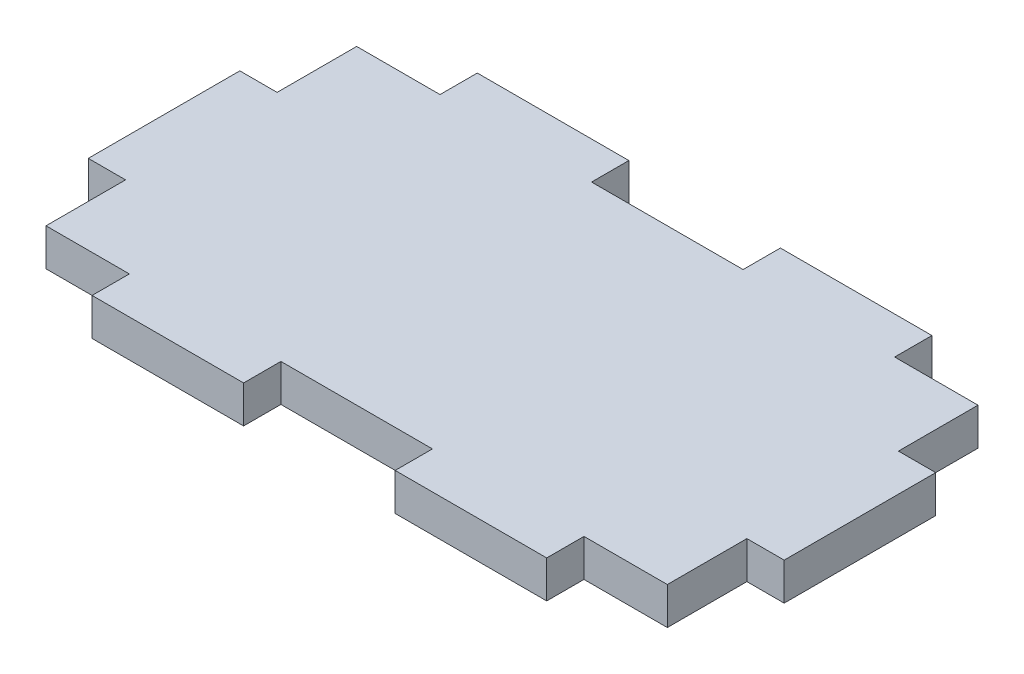
ISO-10303-21;
HEADER;
FILE_DESCRIPTION(('STEP AP214'),'2;1');
FILE_NAME('part.step','',(''),(''),'','','');
FILE_SCHEMA(('AUTOMOTIVE_DESIGN { 1 0 10303 214 1 1 1 1 }'));
ENDSEC;
DATA;
#1=APPLICATION_CONTEXT('core data for automotive mechanical design processes');
#2=APPLICATION_PROTOCOL_DEFINITION('international standard','automotive_design',2000,#1);
#3=PRODUCT_CONTEXT('',#1,'mechanical');
#4=PRODUCT('Part','Part','',(#3));
#5=PRODUCT_RELATED_PRODUCT_CATEGORY('part','',(#4));
#6=PRODUCT_DEFINITION_FORMATION('','',#4);
#7=PRODUCT_DEFINITION_CONTEXT('part definition',#1,'design');
#8=PRODUCT_DEFINITION('design','',#6,#7);
#9=PRODUCT_DEFINITION_SHAPE('','',#8);
#10=(LENGTH_UNIT() NAMED_UNIT(*) SI_UNIT(.MILLI.,.METRE.));
#11=(NAMED_UNIT(*) PLANE_ANGLE_UNIT() SI_UNIT($,.RADIAN.));
#12=(NAMED_UNIT(*) SI_UNIT($,.STERADIAN.) SOLID_ANGLE_UNIT());
#13=UNCERTAINTY_MEASURE_WITH_UNIT(LENGTH_MEASURE(1.E-05),#10,'distance_accuracy_value','');
#14=(GEOMETRIC_REPRESENTATION_CONTEXT(3) GLOBAL_UNCERTAINTY_ASSIGNED_CONTEXT((#13)) GLOBAL_UNIT_ASSIGNED_CONTEXT((#10,
#11,#12)) REPRESENTATION_CONTEXT('',''));
#15=CARTESIAN_POINT('',(0.,0.,0.));
#16=DIRECTION('',(0.,0.,1.));
#17=DIRECTION('',(1.,0.,0.));
#18=AXIS2_PLACEMENT_3D('',#15,#16,#17);
#19=CARTESIAN_POINT('',(199.415,6.,-59.));
#20=DIRECTION('',(0.,0.,1.));
#21=DIRECTION('',(1.,0.,0.));
#22=AXIS2_PLACEMENT_3D('',#19,#20,#21);
#23=PLANE('',#22);
#24=DIRECTION('',(-1.,0.,0.));
#25=VECTOR('',#24,1.);
#26=CARTESIAN_POINT('',(199.415,0.,-59.));
#27=LINE('',#26,#25);
#28=CARTESIAN_POINT('',(199.415,0.,-59.));
#29=VERTEX_POINT('',#28);
#30=CARTESIAN_POINT('',(186.,0.,-59.));
#31=VERTEX_POINT('',#30);
#32=EDGE_CURVE('E260',#29,#31,#27,.T.);
#33=ORIENTED_EDGE('',*,*,#32,.T.);
#34=DIRECTION('',(0.,-1.,0.));
#35=VECTOR('',#34,1.);
#36=CARTESIAN_POINT('',(186.,6.,-59.));
#37=LINE('',#36,#35);
#38=CARTESIAN_POINT('',(186.,6.,-59.));
#39=VERTEX_POINT('',#38);
#40=EDGE_CURVE('E11',#39,#31,#37,.T.);
#41=ORIENTED_EDGE('',*,*,#40,.F.);
#42=DIRECTION('',(-1.,0.,0.));
#43=VECTOR('',#42,1.);
#44=CARTESIAN_POINT('',(199.415,6.,-59.));
#45=LINE('',#44,#43);
#46=CARTESIAN_POINT('',(199.415,6.,-59.));
#47=VERTEX_POINT('',#46);
#48=EDGE_CURVE('E342',#47,#39,#45,.T.);
#49=ORIENTED_EDGE('',*,*,#48,.F.);
#50=DIRECTION('',(0.,-1.,0.));
#51=VECTOR('',#50,1.);
#52=CARTESIAN_POINT('',(199.415,6.,-59.));
#53=LINE('',#52,#51);
#54=EDGE_CURVE('E256',#47,#29,#53,.T.);
#55=ORIENTED_EDGE('',*,*,#54,.T.);
#56=EDGE_LOOP('',(#33,#41,#49,#55));
#57=FACE_BOUND('',#56,.T.);
#58=ADVANCED_FACE('F39',(#57),#23,.F.);
#59=CARTESIAN_POINT('',(186.,6.,-59.));
#60=DIRECTION('',(1.,0.,0.));
#61=DIRECTION('',(0.,0.,-1.));
#62=AXIS2_PLACEMENT_3D('',#59,#60,#61);
#63=PLANE('',#62);
#64=DIRECTION('',(0.,0.,1.));
#65=VECTOR('',#64,1.);
#66=CARTESIAN_POINT('',(186.,0.,-59.));
#67=LINE('',#66,#65);
#68=CARTESIAN_POINT('',(186.,0.,-46.195));
#69=VERTEX_POINT('',#68);
#70=EDGE_CURVE('E264',#31,#69,#67,.T.);
#71=ORIENTED_EDGE('',*,*,#70,.T.);
#72=DIRECTION('',(0.,-1.,0.));
#73=VECTOR('',#72,1.);
#74=CARTESIAN_POINT('',(186.,6.,-46.195));
#75=LINE('',#74,#73);
#76=CARTESIAN_POINT('',(186.,6.,-46.195));
#77=VERTEX_POINT('',#76);
#78=EDGE_CURVE('E48',#77,#69,#75,.T.);
#79=ORIENTED_EDGE('',*,*,#78,.F.);
#80=DIRECTION('',(0.,0.,1.));
#81=VECTOR('',#80,1.);
#82=CARTESIAN_POINT('',(186.,6.,-59.));
#83=LINE('',#82,#81);
#84=EDGE_CURVE('E159',#39,#77,#83,.T.);
#85=ORIENTED_EDGE('',*,*,#84,.F.);
#86=ORIENTED_EDGE('',*,*,#40,.T.);
#87=EDGE_LOOP('',(#71,#79,#85,#86));
#88=FACE_BOUND('',#87,.T.);
#89=ADVANCED_FACE('F548',(#88),#63,.F.);
#90=CARTESIAN_POINT('',(186.,6.,-46.195));
#91=DIRECTION('',(0.,0.,1.));
#92=DIRECTION('',(1.,0.,0.));
#93=AXIS2_PLACEMENT_3D('',#90,#91,#92);
#94=PLANE('',#93);
#95=DIRECTION('',(-1.,0.,0.));
#96=VECTOR('',#95,1.);
#97=CARTESIAN_POINT('',(186.,0.,-46.195));
#98=LINE('',#97,#96);
#99=CARTESIAN_POINT('',(180.,0.,-46.195));
#100=VERTEX_POINT('',#99);
#101=EDGE_CURVE('E267',#69,#100,#98,.T.);
#102=ORIENTED_EDGE('',*,*,#101,.T.);
#103=DIRECTION('',(0.,-1.,0.));
#104=VECTOR('',#103,1.);
#105=CARTESIAN_POINT('',(180.,6.,-46.195));
#106=LINE('',#105,#104);
#107=CARTESIAN_POINT('',(180.,6.,-46.195));
#108=VERTEX_POINT('',#107);
#109=EDGE_CURVE('E433',#108,#100,#106,.T.);
#110=ORIENTED_EDGE('',*,*,#109,.F.);
#111=DIRECTION('',(-1.,0.,0.));
#112=VECTOR('',#111,1.);
#113=CARTESIAN_POINT('',(186.,6.,-46.195));
#114=LINE('',#113,#112);
#115=EDGE_CURVE('E443',#77,#108,#114,.T.);
#116=ORIENTED_EDGE('',*,*,#115,.F.);
#117=ORIENTED_EDGE('',*,*,#78,.T.);
#118=EDGE_LOOP('',(#102,#110,#116,#117));
#119=FACE_BOUND('',#118,.T.);
#120=ADVANCED_FACE('F441',(#119),#94,.F.);
#121=CARTESIAN_POINT('',(180.,6.,-46.195));
#122=DIRECTION('',(1.,0.,0.));
#123=DIRECTION('',(0.,0.,-1.));
#124=AXIS2_PLACEMENT_3D('',#121,#122,#123);
#125=PLANE('',#124);
#126=DIRECTION('',(0.,0.,1.));
#127=VECTOR('',#126,1.);
#128=CARTESIAN_POINT('',(180.,0.,-46.195));
#129=LINE('',#128,#127);
#130=CARTESIAN_POINT('',(180.,0.,-21.805));
#131=VERTEX_POINT('',#130);
#132=EDGE_CURVE('E270',#100,#131,#129,.T.);
#133=ORIENTED_EDGE('',*,*,#132,.T.);
#134=DIRECTION('',(0.,-1.,0.));
#135=VECTOR('',#134,1.);
#136=CARTESIAN_POINT('',(180.,6.,-21.805));
#137=LINE('',#136,#135);
#138=CARTESIAN_POINT('',(180.,6.,-21.805));
#139=VERTEX_POINT('',#138);
#140=EDGE_CURVE('E429',#139,#131,#137,.T.);
#141=ORIENTED_EDGE('',*,*,#140,.F.);
#142=DIRECTION('',(0.,0.,1.));
#143=VECTOR('',#142,1.);
#144=CARTESIAN_POINT('',(180.,6.,-46.195));
#145=LINE('',#144,#143);
#146=EDGE_CURVE('E462',#108,#139,#145,.T.);
#147=ORIENTED_EDGE('',*,*,#146,.F.);
#148=ORIENTED_EDGE('',*,*,#109,.T.);
#149=EDGE_LOOP('',(#133,#141,#147,#148));
#150=FACE_BOUND('',#149,.T.);
#151=ADVANCED_FACE('F452',(#150),#125,.F.);
#152=CARTESIAN_POINT('',(180.,6.,-21.805));
#153=DIRECTION('',(0.,0.,-1.));
#154=DIRECTION('',(-1.,0.,0.));
#155=AXIS2_PLACEMENT_3D('',#152,#153,#154);
#156=PLANE('',#155);
#157=DIRECTION('',(1.,0.,0.));
#158=VECTOR('',#157,1.);
#159=CARTESIAN_POINT('',(180.,0.,-21.805));
#160=LINE('',#159,#158);
#161=CARTESIAN_POINT('',(186.,0.,-21.805));
#162=VERTEX_POINT('',#161);
#163=EDGE_CURVE('E273',#131,#162,#160,.T.);
#164=ORIENTED_EDGE('',*,*,#163,.T.);
#165=DIRECTION('',(0.,-1.,0.));
#166=VECTOR('',#165,1.);
#167=CARTESIAN_POINT('',(186.,6.,-21.805));
#168=LINE('',#167,#166);
#169=CARTESIAN_POINT('',(186.,6.,-21.805));
#170=VERTEX_POINT('',#169);
#171=EDGE_CURVE('E425',#170,#162,#168,.T.);
#172=ORIENTED_EDGE('',*,*,#171,.F.);
#173=DIRECTION('',(1.,0.,0.));
#174=VECTOR('',#173,1.);
#175=CARTESIAN_POINT('',(180.,6.,-21.805));
#176=LINE('',#175,#174);
#177=EDGE_CURVE('E458',#139,#170,#176,.T.);
#178=ORIENTED_EDGE('',*,*,#177,.F.);
#179=ORIENTED_EDGE('',*,*,#140,.T.);
#180=EDGE_LOOP('',(#164,#172,#178,#179));
#181=FACE_BOUND('',#180,.T.);
#182=ADVANCED_FACE('F456',(#181),#156,.F.);
#183=CARTESIAN_POINT('',(186.,6.,-21.805));
#184=DIRECTION('',(1.,0.,0.));
#185=DIRECTION('',(0.,0.,-1.));
#186=AXIS2_PLACEMENT_3D('',#183,#184,#185);
#187=PLANE('',#186);
#188=DIRECTION('',(0.,0.,1.));
#189=VECTOR('',#188,1.);
#190=CARTESIAN_POINT('',(186.,0.,-21.805));
#191=LINE('',#190,#189);
#192=CARTESIAN_POINT('',(186.,0.,-9.));
#193=VERTEX_POINT('',#192);
#194=EDGE_CURVE('E276',#162,#193,#191,.T.);
#195=ORIENTED_EDGE('',*,*,#194,.T.);
#196=DIRECTION('',(0.,-1.,0.));
#197=VECTOR('',#196,1.);
#198=CARTESIAN_POINT('',(186.,6.,-9.));
#199=LINE('',#198,#197);
#200=CARTESIAN_POINT('',(186.,6.,-9.));
#201=VERTEX_POINT('',#200);
#202=EDGE_CURVE('E421',#201,#193,#199,.T.);
#203=ORIENTED_EDGE('',*,*,#202,.F.);
#204=DIRECTION('',(0.,0.,1.));
#205=VECTOR('',#204,1.);
#206=CARTESIAN_POINT('',(186.,6.,-21.805));
#207=LINE('',#206,#205);
#208=EDGE_CURVE('E461',#170,#201,#207,.T.);
#209=ORIENTED_EDGE('',*,*,#208,.F.);
#210=ORIENTED_EDGE('',*,*,#171,.T.);
#211=EDGE_LOOP('',(#195,#203,#209,#210));
#212=FACE_BOUND('',#211,.T.);
#213=ADVANCED_FACE('F561',(#212),#187,.F.);
#214=CARTESIAN_POINT('',(186.,6.,-9.));
#215=DIRECTION('',(0.,0.,-1.));
#216=DIRECTION('',(-1.,0.,0.));
#217=AXIS2_PLACEMENT_3D('',#214,#215,#216);
#218=PLANE('',#217);
#219=DIRECTION('',(1.,0.,0.));
#220=VECTOR('',#219,1.);
#221=CARTESIAN_POINT('',(186.,0.,-9.));
#222=LINE('',#221,#220);
#223=CARTESIAN_POINT('',(199.415,0.,-9.));
#224=VERTEX_POINT('',#223);
#225=EDGE_CURVE('E279',#193,#224,#222,.T.);
#226=ORIENTED_EDGE('',*,*,#225,.T.);
#227=DIRECTION('',(0.,-1.,0.));
#228=VECTOR('',#227,1.);
#229=CARTESIAN_POINT('',(199.415,6.,-9.));
#230=LINE('',#229,#228);
#231=CARTESIAN_POINT('',(199.415,6.,-9.));
#232=VERTEX_POINT('',#231);
#233=EDGE_CURVE('E417',#232,#224,#230,.T.);
#234=ORIENTED_EDGE('',*,*,#233,.F.);
#235=DIRECTION('',(1.,0.,0.));
#236=VECTOR('',#235,1.);
#237=CARTESIAN_POINT('',(186.,6.,-9.));
#238=LINE('',#237,#236);
#239=EDGE_CURVE('E466',#201,#232,#238,.T.);
#240=ORIENTED_EDGE('',*,*,#239,.F.);
#241=ORIENTED_EDGE('',*,*,#202,.T.);
#242=EDGE_LOOP('',(#226,#234,#240,#241));
#243=FACE_BOUND('',#242,.T.);
#244=ADVANCED_FACE('F564',(#243),#218,.F.);
#245=CARTESIAN_POINT('',(199.415,6.,-9.));
#246=DIRECTION('',(1.,0.,0.));
#247=DIRECTION('',(0.,0.,-1.));
#248=AXIS2_PLACEMENT_3D('',#245,#246,#247);
#249=PLANE('',#248);
#250=DIRECTION('',(0.,0.,1.));
#251=VECTOR('',#250,1.);
#252=CARTESIAN_POINT('',(199.415,0.,-9.));
#253=LINE('',#252,#251);
#254=CARTESIAN_POINT('',(199.415,0.,-3.));
#255=VERTEX_POINT('',#254);
#256=EDGE_CURVE('E282',#224,#255,#253,.T.);
#257=ORIENTED_EDGE('',*,*,#256,.T.);
#258=DIRECTION('',(0.,-1.,0.));
#259=VECTOR('',#258,1.);
#260=CARTESIAN_POINT('',(199.415,6.,-3.));
#261=LINE('',#260,#259);
#262=CARTESIAN_POINT('',(199.415,6.,-3.));
#263=VERTEX_POINT('',#262);
#264=EDGE_CURVE('E413',#263,#255,#261,.T.);
#265=ORIENTED_EDGE('',*,*,#264,.F.);
#266=DIRECTION('',(0.,0.,1.));
#267=VECTOR('',#266,1.);
#268=CARTESIAN_POINT('',(199.415,6.,-9.));
#269=LINE('',#268,#267);
#270=EDGE_CURVE('E473',#232,#263,#269,.T.);
#271=ORIENTED_EDGE('',*,*,#270,.F.);
#272=ORIENTED_EDGE('',*,*,#233,.T.);
#273=EDGE_LOOP('',(#257,#265,#271,#272));
#274=FACE_BOUND('',#273,.T.);
#275=ADVANCED_FACE('F568',(#274),#249,.F.);
#276=CARTESIAN_POINT('',(199.415,6.,-3.));
#277=DIRECTION('',(0.,0.,-1.));
#278=DIRECTION('',(-1.,0.,0.));
#279=AXIS2_PLACEMENT_3D('',#276,#277,#278);
#280=PLANE('',#279);
#281=DIRECTION('',(1.,0.,0.));
#282=VECTOR('',#281,1.);
#283=CARTESIAN_POINT('',(199.415,0.,-3.));
#284=LINE('',#283,#282);
#285=CARTESIAN_POINT('',(223.805,0.,-3.));
#286=VERTEX_POINT('',#285);
#287=EDGE_CURVE('E285',#255,#286,#284,.T.);
#288=ORIENTED_EDGE('',*,*,#287,.T.);
#289=DIRECTION('',(0.,-1.,0.));
#290=VECTOR('',#289,1.);
#291=CARTESIAN_POINT('',(223.805,6.,-3.));
#292=LINE('',#291,#290);
#293=CARTESIAN_POINT('',(223.805,6.,-3.));
#294=VERTEX_POINT('',#293);
#295=EDGE_CURVE('E409',#294,#286,#292,.T.);
#296=ORIENTED_EDGE('',*,*,#295,.F.);
#297=DIRECTION('',(1.,0.,0.));
#298=VECTOR('',#297,1.);
#299=CARTESIAN_POINT('',(199.415,6.,-3.));
#300=LINE('',#299,#298);
#301=EDGE_CURVE('E476',#263,#294,#300,.T.);
#302=ORIENTED_EDGE('',*,*,#301,.F.);
#303=ORIENTED_EDGE('',*,*,#264,.T.);
#304=EDGE_LOOP('',(#288,#296,#302,#303));
#305=FACE_BOUND('',#304,.T.);
#306=ADVANCED_FACE('F572',(#305),#280,.F.);
#307=CARTESIAN_POINT('',(223.805,6.,-3.));
#308=DIRECTION('',(-1.,0.,0.));
#309=DIRECTION('',(0.,0.,1.));
#310=AXIS2_PLACEMENT_3D('',#307,#308,#309);
#311=PLANE('',#310);
#312=DIRECTION('',(0.,0.,-1.));
#313=VECTOR('',#312,1.);
#314=CARTESIAN_POINT('',(223.805,0.,-3.));
#315=LINE('',#314,#313);
#316=CARTESIAN_POINT('',(223.805,0.,-9.));
#317=VERTEX_POINT('',#316);
#318=EDGE_CURVE('E288',#286,#317,#315,.T.);
#319=ORIENTED_EDGE('',*,*,#318,.T.);
#320=DIRECTION('',(0.,-1.,0.));
#321=VECTOR('',#320,1.);
#322=CARTESIAN_POINT('',(223.805,6.,-9.));
#323=LINE('',#322,#321);
#324=CARTESIAN_POINT('',(223.805,6.,-9.));
#325=VERTEX_POINT('',#324);
#326=EDGE_CURVE('E405',#325,#317,#323,.T.);
#327=ORIENTED_EDGE('',*,*,#326,.F.);
#328=DIRECTION('',(0.,0.,-1.));
#329=VECTOR('',#328,1.);
#330=CARTESIAN_POINT('',(223.805,6.,-3.));
#331=LINE('',#330,#329);
#332=EDGE_CURVE('E479',#294,#325,#331,.T.);
#333=ORIENTED_EDGE('',*,*,#332,.F.);
#334=ORIENTED_EDGE('',*,*,#295,.T.);
#335=EDGE_LOOP('',(#319,#327,#333,#334));
#336=FACE_BOUND('',#335,.T.);
#337=ADVANCED_FACE('F576',(#336),#311,.F.);
#338=CARTESIAN_POINT('',(223.805,6.,-9.));
#339=DIRECTION('',(0.,0.,-1.));
#340=DIRECTION('',(-1.,0.,0.));
#341=AXIS2_PLACEMENT_3D('',#338,#339,#340);
#342=PLANE('',#341);
#343=DIRECTION('',(1.,0.,0.));
#344=VECTOR('',#343,1.);
#345=CARTESIAN_POINT('',(223.805,0.,-9.));
#346=LINE('',#345,#344);
#347=CARTESIAN_POINT('',(248.195,0.,-9.));
#348=VERTEX_POINT('',#347);
#349=EDGE_CURVE('E291',#317,#348,#346,.T.);
#350=ORIENTED_EDGE('',*,*,#349,.T.);
#351=DIRECTION('',(0.,-1.,0.));
#352=VECTOR('',#351,1.);
#353=CARTESIAN_POINT('',(248.195,6.,-9.));
#354=LINE('',#353,#352);
#355=CARTESIAN_POINT('',(248.195,6.,-9.));
#356=VERTEX_POINT('',#355);
#357=EDGE_CURVE('E401',#356,#348,#354,.T.);
#358=ORIENTED_EDGE('',*,*,#357,.F.);
#359=DIRECTION('',(1.,0.,0.));
#360=VECTOR('',#359,1.);
#361=CARTESIAN_POINT('',(223.805,6.,-9.));
#362=LINE('',#361,#360);
#363=EDGE_CURVE('E482',#325,#356,#362,.T.);
#364=ORIENTED_EDGE('',*,*,#363,.F.);
#365=ORIENTED_EDGE('',*,*,#326,.T.);
#366=EDGE_LOOP('',(#350,#358,#364,#365));
#367=FACE_BOUND('',#366,.T.);
#368=ADVANCED_FACE('F580',(#367),#342,.F.);
#369=CARTESIAN_POINT('',(248.195,6.,-9.));
#370=DIRECTION('',(1.,0.,0.));
#371=DIRECTION('',(0.,0.,-1.));
#372=AXIS2_PLACEMENT_3D('',#369,#370,#371);
#373=PLANE('',#372);
#374=DIRECTION('',(0.,0.,1.));
#375=VECTOR('',#374,1.);
#376=CARTESIAN_POINT('',(248.195,0.,-9.));
#377=LINE('',#376,#375);
#378=CARTESIAN_POINT('',(248.195,0.,-3.));
#379=VERTEX_POINT('',#378);
#380=EDGE_CURVE('E294',#348,#379,#377,.T.);
#381=ORIENTED_EDGE('',*,*,#380,.T.);
#382=DIRECTION('',(0.,-1.,0.));
#383=VECTOR('',#382,1.);
#384=CARTESIAN_POINT('',(248.195,6.,-3.));
#385=LINE('',#384,#383);
#386=CARTESIAN_POINT('',(248.195,6.,-3.));
#387=VERTEX_POINT('',#386);
#388=EDGE_CURVE('E397',#387,#379,#385,.T.);
#389=ORIENTED_EDGE('',*,*,#388,.F.);
#390=DIRECTION('',(0.,0.,1.));
#391=VECTOR('',#390,1.);
#392=CARTESIAN_POINT('',(248.195,6.,-9.));
#393=LINE('',#392,#391);
#394=EDGE_CURVE('E485',#356,#387,#393,.T.);
#395=ORIENTED_EDGE('',*,*,#394,.F.);
#396=ORIENTED_EDGE('',*,*,#357,.T.);
#397=EDGE_LOOP('',(#381,#389,#395,#396));
#398=FACE_BOUND('',#397,.T.);
#399=ADVANCED_FACE('F584',(#398),#373,.F.);
#400=CARTESIAN_POINT('',(248.195,6.,-3.));
#401=DIRECTION('',(0.,0.,-1.));
#402=DIRECTION('',(-1.,0.,0.));
#403=AXIS2_PLACEMENT_3D('',#400,#401,#402);
#404=PLANE('',#403);
#405=DIRECTION('',(1.,0.,0.));
#406=VECTOR('',#405,1.);
#407=CARTESIAN_POINT('',(248.195,0.,-3.));
#408=LINE('',#407,#406);
#409=CARTESIAN_POINT('',(272.585,0.,-3.));
#410=VERTEX_POINT('',#409);
#411=EDGE_CURVE('E297',#379,#410,#408,.T.);
#412=ORIENTED_EDGE('',*,*,#411,.T.);
#413=DIRECTION('',(0.,-1.,0.));
#414=VECTOR('',#413,1.);
#415=CARTESIAN_POINT('',(272.585,6.,-3.));
#416=LINE('',#415,#414);
#417=CARTESIAN_POINT('',(272.585,6.,-3.));
#418=VERTEX_POINT('',#417);
#419=EDGE_CURVE('E393',#418,#410,#416,.T.);
#420=ORIENTED_EDGE('',*,*,#419,.F.);
#421=DIRECTION('',(1.,0.,0.));
#422=VECTOR('',#421,1.);
#423=CARTESIAN_POINT('',(248.195,6.,-3.));
#424=LINE('',#423,#422);
#425=EDGE_CURVE('E488',#387,#418,#424,.T.);
#426=ORIENTED_EDGE('',*,*,#425,.F.);
#427=ORIENTED_EDGE('',*,*,#388,.T.);
#428=EDGE_LOOP('',(#412,#420,#426,#427));
#429=FACE_BOUND('',#428,.T.);
#430=ADVANCED_FACE('F588',(#429),#404,.F.);
#431=CARTESIAN_POINT('',(272.585,6.,-3.));
#432=DIRECTION('',(-1.,0.,0.));
#433=DIRECTION('',(0.,0.,1.));
#434=AXIS2_PLACEMENT_3D('',#431,#432,#433);
#435=PLANE('',#434);
#436=DIRECTION('',(0.,0.,-1.));
#437=VECTOR('',#436,1.);
#438=CARTESIAN_POINT('',(272.585,0.,-3.));
#439=LINE('',#438,#437);
#440=CARTESIAN_POINT('',(272.585,0.,-9.));
#441=VERTEX_POINT('',#440);
#442=EDGE_CURVE('E300',#410,#441,#439,.T.);
#443=ORIENTED_EDGE('',*,*,#442,.T.);
#444=DIRECTION('',(0.,-1.,0.));
#445=VECTOR('',#444,1.);
#446=CARTESIAN_POINT('',(272.585,6.,-9.));
#447=LINE('',#446,#445);
#448=CARTESIAN_POINT('',(272.585,6.,-9.));
#449=VERTEX_POINT('',#448);
#450=EDGE_CURVE('E389',#449,#441,#447,.T.);
#451=ORIENTED_EDGE('',*,*,#450,.F.);
#452=DIRECTION('',(0.,0.,-1.));
#453=VECTOR('',#452,1.);
#454=CARTESIAN_POINT('',(272.585,6.,-3.));
#455=LINE('',#454,#453);
#456=EDGE_CURVE('E491',#418,#449,#455,.T.);
#457=ORIENTED_EDGE('',*,*,#456,.F.);
#458=ORIENTED_EDGE('',*,*,#419,.T.);
#459=EDGE_LOOP('',(#443,#451,#457,#458));
#460=FACE_BOUND('',#459,.T.);
#461=ADVANCED_FACE('F592',(#460),#435,.F.);
#462=CARTESIAN_POINT('',(272.585,6.,-9.));
#463=DIRECTION('',(0.,0.,-1.));
#464=DIRECTION('',(-1.,0.,0.));
#465=AXIS2_PLACEMENT_3D('',#462,#463,#464);
#466=PLANE('',#465);
#467=DIRECTION('',(1.,0.,0.));
#468=VECTOR('',#467,1.);
#469=CARTESIAN_POINT('',(272.585,0.,-9.));
#470=LINE('',#469,#468);
#471=CARTESIAN_POINT('',(286.,0.,-9.));
#472=VERTEX_POINT('',#471);
#473=EDGE_CURVE('E303',#441,#472,#470,.T.);
#474=ORIENTED_EDGE('',*,*,#473,.T.);
#475=DIRECTION('',(0.,-1.,0.));
#476=VECTOR('',#475,1.);
#477=CARTESIAN_POINT('',(286.,6.,-9.));
#478=LINE('',#477,#476);
#479=CARTESIAN_POINT('',(286.,6.,-9.));
#480=VERTEX_POINT('',#479);
#481=EDGE_CURVE('E385',#480,#472,#478,.T.);
#482=ORIENTED_EDGE('',*,*,#481,.F.);
#483=DIRECTION('',(1.,0.,0.));
#484=VECTOR('',#483,1.);
#485=CARTESIAN_POINT('',(272.585,6.,-9.));
#486=LINE('',#485,#484);
#487=EDGE_CURVE('E494',#449,#480,#486,.T.);
#488=ORIENTED_EDGE('',*,*,#487,.F.);
#489=ORIENTED_EDGE('',*,*,#450,.T.);
#490=EDGE_LOOP('',(#474,#482,#488,#489));
#491=FACE_BOUND('',#490,.T.);
#492=ADVANCED_FACE('F596',(#491),#466,.F.);
#493=CARTESIAN_POINT('',(286.,6.,-9.));
#494=DIRECTION('',(-1.,0.,0.));
#495=DIRECTION('',(0.,0.,1.));
#496=AXIS2_PLACEMENT_3D('',#493,#494,#495);
#497=PLANE('',#496);
#498=DIRECTION('',(0.,0.,-1.));
#499=VECTOR('',#498,1.);
#500=CARTESIAN_POINT('',(286.,0.,-9.));
#501=LINE('',#500,#499);
#502=CARTESIAN_POINT('',(286.,0.,-21.805));
#503=VERTEX_POINT('',#502);
#504=EDGE_CURVE('E306',#472,#503,#501,.T.);
#505=ORIENTED_EDGE('',*,*,#504,.T.);
#506=DIRECTION('',(0.,-1.,0.));
#507=VECTOR('',#506,1.);
#508=CARTESIAN_POINT('',(286.,6.,-21.805));
#509=LINE('',#508,#507);
#510=CARTESIAN_POINT('',(286.,6.,-21.805));
#511=VERTEX_POINT('',#510);
#512=EDGE_CURVE('E381',#511,#503,#509,.T.);
#513=ORIENTED_EDGE('',*,*,#512,.F.);
#514=DIRECTION('',(0.,0.,-1.));
#515=VECTOR('',#514,1.);
#516=CARTESIAN_POINT('',(286.,6.,-9.));
#517=LINE('',#516,#515);
#518=EDGE_CURVE('E497',#480,#511,#517,.T.);
#519=ORIENTED_EDGE('',*,*,#518,.F.);
#520=ORIENTED_EDGE('',*,*,#481,.T.);
#521=EDGE_LOOP('',(#505,#513,#519,#520));
#522=FACE_BOUND('',#521,.T.);
#523=ADVANCED_FACE('F600',(#522),#497,.F.);
#524=CARTESIAN_POINT('',(286.,6.,-21.805));
#525=DIRECTION('',(0.,0.,-1.));
#526=DIRECTION('',(-1.,0.,0.));
#527=AXIS2_PLACEMENT_3D('',#524,#525,#526);
#528=PLANE('',#527);
#529=DIRECTION('',(1.,0.,0.));
#530=VECTOR('',#529,1.);
#531=CARTESIAN_POINT('',(286.,0.,-21.805));
#532=LINE('',#531,#530);
#533=CARTESIAN_POINT('',(292.,0.,-21.805));
#534=VERTEX_POINT('',#533);
#535=EDGE_CURVE('E309',#503,#534,#532,.T.);
#536=ORIENTED_EDGE('',*,*,#535,.T.);
#537=DIRECTION('',(0.,-1.,0.));
#538=VECTOR('',#537,1.);
#539=CARTESIAN_POINT('',(292.,6.,-21.805));
#540=LINE('',#539,#538);
#541=CARTESIAN_POINT('',(292.,6.,-21.805));
#542=VERTEX_POINT('',#541);
#543=EDGE_CURVE('E377',#542,#534,#540,.T.);
#544=ORIENTED_EDGE('',*,*,#543,.F.);
#545=DIRECTION('',(1.,0.,0.));
#546=VECTOR('',#545,1.);
#547=CARTESIAN_POINT('',(286.,6.,-21.805));
#548=LINE('',#547,#546);
#549=EDGE_CURVE('E500',#511,#542,#548,.T.);
#550=ORIENTED_EDGE('',*,*,#549,.F.);
#551=ORIENTED_EDGE('',*,*,#512,.T.);
#552=EDGE_LOOP('',(#536,#544,#550,#551));
#553=FACE_BOUND('',#552,.T.);
#554=ADVANCED_FACE('F604',(#553),#528,.F.);
#555=CARTESIAN_POINT('',(292.,6.,-21.805));
#556=DIRECTION('',(-1.,0.,0.));
#557=DIRECTION('',(0.,0.,1.));
#558=AXIS2_PLACEMENT_3D('',#555,#556,#557);
#559=PLANE('',#558);
#560=DIRECTION('',(0.,0.,-1.));
#561=VECTOR('',#560,1.);
#562=CARTESIAN_POINT('',(292.,0.,-21.805));
#563=LINE('',#562,#561);
#564=CARTESIAN_POINT('',(292.,0.,-46.195));
#565=VERTEX_POINT('',#564);
#566=EDGE_CURVE('E312',#534,#565,#563,.T.);
#567=ORIENTED_EDGE('',*,*,#566,.T.);
#568=DIRECTION('',(0.,-1.,0.));
#569=VECTOR('',#568,1.);
#570=CARTESIAN_POINT('',(292.,6.,-46.195));
#571=LINE('',#570,#569);
#572=CARTESIAN_POINT('',(292.,6.,-46.195));
#573=VERTEX_POINT('',#572);
#574=EDGE_CURVE('E373',#573,#565,#571,.T.);
#575=ORIENTED_EDGE('',*,*,#574,.F.);
#576=DIRECTION('',(0.,0.,-1.));
#577=VECTOR('',#576,1.);
#578=CARTESIAN_POINT('',(292.,6.,-21.805));
#579=LINE('',#578,#577);
#580=EDGE_CURVE('E503',#542,#573,#579,.T.);
#581=ORIENTED_EDGE('',*,*,#580,.F.);
#582=ORIENTED_EDGE('',*,*,#543,.T.);
#583=EDGE_LOOP('',(#567,#575,#581,#582));
#584=FACE_BOUND('',#583,.T.);
#585=ADVANCED_FACE('F608',(#584),#559,.F.);
#586=CARTESIAN_POINT('',(292.,6.,-46.195));
#587=DIRECTION('',(0.,0.,1.));
#588=DIRECTION('',(1.,0.,0.));
#589=AXIS2_PLACEMENT_3D('',#586,#587,#588);
#590=PLANE('',#589);
#591=DIRECTION('',(-1.,0.,0.));
#592=VECTOR('',#591,1.);
#593=CARTESIAN_POINT('',(292.,0.,-46.195));
#594=LINE('',#593,#592);
#595=CARTESIAN_POINT('',(286.,0.,-46.195));
#596=VERTEX_POINT('',#595);
#597=EDGE_CURVE('E315',#565,#596,#594,.T.);
#598=ORIENTED_EDGE('',*,*,#597,.T.);
#599=DIRECTION('',(0.,-1.,0.));
#600=VECTOR('',#599,1.);
#601=CARTESIAN_POINT('',(286.,6.,-46.195));
#602=LINE('',#601,#600);
#603=CARTESIAN_POINT('',(286.,6.,-46.195));
#604=VERTEX_POINT('',#603);
#605=EDGE_CURVE('E369',#604,#596,#602,.T.);
#606=ORIENTED_EDGE('',*,*,#605,.F.);
#607=DIRECTION('',(-1.,0.,0.));
#608=VECTOR('',#607,1.);
#609=CARTESIAN_POINT('',(292.,6.,-46.195));
#610=LINE('',#609,#608);
#611=EDGE_CURVE('E506',#573,#604,#610,.T.);
#612=ORIENTED_EDGE('',*,*,#611,.F.);
#613=ORIENTED_EDGE('',*,*,#574,.T.);
#614=EDGE_LOOP('',(#598,#606,#612,#613));
#615=FACE_BOUND('',#614,.T.);
#616=ADVANCED_FACE('F612',(#615),#590,.F.);
#617=CARTESIAN_POINT('',(286.,6.,-46.195));
#618=DIRECTION('',(-1.,0.,0.));
#619=DIRECTION('',(0.,0.,1.));
#620=AXIS2_PLACEMENT_3D('',#617,#618,#619);
#621=PLANE('',#620);
#622=DIRECTION('',(0.,0.,-1.));
#623=VECTOR('',#622,1.);
#624=CARTESIAN_POINT('',(286.,0.,-46.195));
#625=LINE('',#624,#623);
#626=CARTESIAN_POINT('',(286.,0.,-59.));
#627=VERTEX_POINT('',#626);
#628=EDGE_CURVE('E318',#596,#627,#625,.T.);
#629=ORIENTED_EDGE('',*,*,#628,.T.);
#630=DIRECTION('',(0.,-1.,0.));
#631=VECTOR('',#630,1.);
#632=CARTESIAN_POINT('',(286.,6.,-59.));
#633=LINE('',#632,#631);
#634=CARTESIAN_POINT('',(286.,6.,-59.));
#635=VERTEX_POINT('',#634);
#636=EDGE_CURVE('E365',#635,#627,#633,.T.);
#637=ORIENTED_EDGE('',*,*,#636,.F.);
#638=DIRECTION('',(0.,0.,-1.));
#639=VECTOR('',#638,1.);
#640=CARTESIAN_POINT('',(286.,6.,-46.195));
#641=LINE('',#640,#639);
#642=EDGE_CURVE('E509',#604,#635,#641,.T.);
#643=ORIENTED_EDGE('',*,*,#642,.F.);
#644=ORIENTED_EDGE('',*,*,#605,.T.);
#645=EDGE_LOOP('',(#629,#637,#643,#644));
#646=FACE_BOUND('',#645,.T.);
#647=ADVANCED_FACE('F616',(#646),#621,.F.);
#648=CARTESIAN_POINT('',(286.,6.,-59.));
#649=DIRECTION('',(0.,0.,1.));
#650=DIRECTION('',(1.,0.,0.));
#651=AXIS2_PLACEMENT_3D('',#648,#649,#650);
#652=PLANE('',#651);
#653=DIRECTION('',(-1.,0.,0.));
#654=VECTOR('',#653,1.);
#655=CARTESIAN_POINT('',(286.,0.,-59.));
#656=LINE('',#655,#654);
#657=CARTESIAN_POINT('',(272.585,0.,-59.));
#658=VERTEX_POINT('',#657);
#659=EDGE_CURVE('E321',#627,#658,#656,.T.);
#660=ORIENTED_EDGE('',*,*,#659,.T.);
#661=DIRECTION('',(0.,-1.,0.));
#662=VECTOR('',#661,1.);
#663=CARTESIAN_POINT('',(272.585,6.,-59.));
#664=LINE('',#663,#662);
#665=CARTESIAN_POINT('',(272.585,6.,-59.));
#666=VERTEX_POINT('',#665);
#667=EDGE_CURVE('E361',#666,#658,#664,.T.);
#668=ORIENTED_EDGE('',*,*,#667,.F.);
#669=DIRECTION('',(-1.,0.,0.));
#670=VECTOR('',#669,1.);
#671=CARTESIAN_POINT('',(286.,6.,-59.));
#672=LINE('',#671,#670);
#673=EDGE_CURVE('E512',#635,#666,#672,.T.);
#674=ORIENTED_EDGE('',*,*,#673,.F.);
#675=ORIENTED_EDGE('',*,*,#636,.T.);
#676=EDGE_LOOP('',(#660,#668,#674,#675));
#677=FACE_BOUND('',#676,.T.);
#678=ADVANCED_FACE('F620',(#677),#652,.F.);
#679=CARTESIAN_POINT('',(272.585,6.,-59.));
#680=DIRECTION('',(-1.,0.,0.));
#681=DIRECTION('',(0.,0.,1.));
#682=AXIS2_PLACEMENT_3D('',#679,#680,#681);
#683=PLANE('',#682);
#684=DIRECTION('',(0.,0.,-1.));
#685=VECTOR('',#684,1.);
#686=CARTESIAN_POINT('',(272.585,0.,-59.));
#687=LINE('',#686,#685);
#688=CARTESIAN_POINT('',(272.585,0.,-65.));
#689=VERTEX_POINT('',#688);
#690=EDGE_CURVE('E324',#658,#689,#687,.T.);
#691=ORIENTED_EDGE('',*,*,#690,.T.);
#692=DIRECTION('',(0.,-1.,0.));
#693=VECTOR('',#692,1.);
#694=CARTESIAN_POINT('',(272.585,6.,-65.));
#695=LINE('',#694,#693);
#696=CARTESIAN_POINT('',(272.585,6.,-65.));
#697=VERTEX_POINT('',#696);
#698=EDGE_CURVE('E357',#697,#689,#695,.T.);
#699=ORIENTED_EDGE('',*,*,#698,.F.);
#700=DIRECTION('',(0.,0.,-1.));
#701=VECTOR('',#700,1.);
#702=CARTESIAN_POINT('',(272.585,6.,-59.));
#703=LINE('',#702,#701);
#704=EDGE_CURVE('E515',#666,#697,#703,.T.);
#705=ORIENTED_EDGE('',*,*,#704,.F.);
#706=ORIENTED_EDGE('',*,*,#667,.T.);
#707=EDGE_LOOP('',(#691,#699,#705,#706));
#708=FACE_BOUND('',#707,.T.);
#709=ADVANCED_FACE('F624',(#708),#683,.F.);
#710=CARTESIAN_POINT('',(272.585,6.,-65.));
#711=DIRECTION('',(0.,0.,1.));
#712=DIRECTION('',(1.,0.,0.));
#713=AXIS2_PLACEMENT_3D('',#710,#711,#712);
#714=PLANE('',#713);
#715=DIRECTION('',(-1.,0.,0.));
#716=VECTOR('',#715,1.);
#717=CARTESIAN_POINT('',(272.585,0.,-65.));
#718=LINE('',#717,#716);
#719=CARTESIAN_POINT('',(248.195,0.,-65.));
#720=VERTEX_POINT('',#719);
#721=EDGE_CURVE('E327',#689,#720,#718,.T.);
#722=ORIENTED_EDGE('',*,*,#721,.T.);
#723=DIRECTION('',(0.,-1.,0.));
#724=VECTOR('',#723,1.);
#725=CARTESIAN_POINT('',(248.195,6.,-65.));
#726=LINE('',#725,#724);
#727=CARTESIAN_POINT('',(248.195,6.,-65.));
#728=VERTEX_POINT('',#727);
#729=EDGE_CURVE('E353',#728,#720,#726,.T.);
#730=ORIENTED_EDGE('',*,*,#729,.F.);
#731=DIRECTION('',(-1.,0.,0.));
#732=VECTOR('',#731,1.);
#733=CARTESIAN_POINT('',(272.585,6.,-65.));
#734=LINE('',#733,#732);
#735=EDGE_CURVE('E518',#697,#728,#734,.T.);
#736=ORIENTED_EDGE('',*,*,#735,.F.);
#737=ORIENTED_EDGE('',*,*,#698,.T.);
#738=EDGE_LOOP('',(#722,#730,#736,#737));
#739=FACE_BOUND('',#738,.T.);
#740=ADVANCED_FACE('F628',(#739),#714,.F.);
#741=CARTESIAN_POINT('',(248.195,6.,-65.));
#742=DIRECTION('',(1.,0.,0.));
#743=DIRECTION('',(0.,0.,-1.));
#744=AXIS2_PLACEMENT_3D('',#741,#742,#743);
#745=PLANE('',#744);
#746=DIRECTION('',(0.,0.,1.));
#747=VECTOR('',#746,1.);
#748=CARTESIAN_POINT('',(248.195,0.,-65.));
#749=LINE('',#748,#747);
#750=CARTESIAN_POINT('',(248.195,0.,-59.));
#751=VERTEX_POINT('',#750);
#752=EDGE_CURVE('E330',#720,#751,#749,.T.);
#753=ORIENTED_EDGE('',*,*,#752,.T.);
#754=DIRECTION('',(0.,-1.,0.));
#755=VECTOR('',#754,1.);
#756=CARTESIAN_POINT('',(248.195,6.,-59.));
#757=LINE('',#756,#755);
#758=CARTESIAN_POINT('',(248.195,6.,-59.));
#759=VERTEX_POINT('',#758);
#760=EDGE_CURVE('E349',#759,#751,#757,.T.);
#761=ORIENTED_EDGE('',*,*,#760,.F.);
#762=DIRECTION('',(0.,0.,1.));
#763=VECTOR('',#762,1.);
#764=CARTESIAN_POINT('',(248.195,6.,-65.));
#765=LINE('',#764,#763);
#766=EDGE_CURVE('E521',#728,#759,#765,.T.);
#767=ORIENTED_EDGE('',*,*,#766,.F.);
#768=ORIENTED_EDGE('',*,*,#729,.T.);
#769=EDGE_LOOP('',(#753,#761,#767,#768));
#770=FACE_BOUND('',#769,.T.);
#771=ADVANCED_FACE('F529',(#770),#745,.F.);
#772=CARTESIAN_POINT('',(248.195,6.,-59.));
#773=DIRECTION('',(0.,0.,1.));
#774=DIRECTION('',(1.,0.,0.));
#775=AXIS2_PLACEMENT_3D('',#772,#773,#774);
#776=PLANE('',#775);
#777=DIRECTION('',(-1.,0.,0.));
#778=VECTOR('',#777,1.);
#779=CARTESIAN_POINT('',(248.195,0.,-59.));
#780=LINE('',#779,#778);
#781=CARTESIAN_POINT('',(223.805,0.,-59.));
#782=VERTEX_POINT('',#781);
#783=EDGE_CURVE('E333',#751,#782,#780,.T.);
#784=ORIENTED_EDGE('',*,*,#783,.T.);
#785=DIRECTION('',(0.,-1.,0.));
#786=VECTOR('',#785,1.);
#787=CARTESIAN_POINT('',(223.805,6.,-59.));
#788=LINE('',#787,#786);
#789=CARTESIAN_POINT('',(223.805,6.,-59.));
#790=VERTEX_POINT('',#789);
#791=EDGE_CURVE('E249',#790,#782,#788,.T.);
#792=ORIENTED_EDGE('',*,*,#791,.F.);
#793=DIRECTION('',(-1.,0.,0.));
#794=VECTOR('',#793,1.);
#795=CARTESIAN_POINT('',(248.195,6.,-59.));
#796=LINE('',#795,#794);
#797=EDGE_CURVE('E238',#759,#790,#796,.T.);
#798=ORIENTED_EDGE('',*,*,#797,.F.);
#799=ORIENTED_EDGE('',*,*,#760,.T.);
#800=EDGE_LOOP('',(#784,#792,#798,#799));
#801=FACE_BOUND('',#800,.T.);
#802=ADVANCED_FACE('F533',(#801),#776,.F.);
#803=CARTESIAN_POINT('',(223.805,6.,-59.));
#804=DIRECTION('',(-1.,0.,0.));
#805=DIRECTION('',(0.,0.,1.));
#806=AXIS2_PLACEMENT_3D('',#803,#804,#805);
#807=PLANE('',#806);
#808=DIRECTION('',(0.,0.,-1.));
#809=VECTOR('',#808,1.);
#810=CARTESIAN_POINT('',(223.805,0.,-59.));
#811=LINE('',#810,#809);
#812=CARTESIAN_POINT('',(223.805,0.,-65.));
#813=VERTEX_POINT('',#812);
#814=EDGE_CURVE('E247',#782,#813,#811,.T.);
#815=ORIENTED_EDGE('',*,*,#814,.T.);
#816=DIRECTION('',(0.,-1.,0.));
#817=VECTOR('',#816,1.);
#818=CARTESIAN_POINT('',(223.805,6.,-65.));
#819=LINE('',#818,#817);
#820=CARTESIAN_POINT('',(223.805,6.,-65.));
#821=VERTEX_POINT('',#820);
#822=EDGE_CURVE('E244',#821,#813,#819,.T.);
#823=ORIENTED_EDGE('',*,*,#822,.F.);
#824=DIRECTION('',(0.,0.,-1.));
#825=VECTOR('',#824,1.);
#826=CARTESIAN_POINT('',(223.805,6.,-59.));
#827=LINE('',#826,#825);
#828=EDGE_CURVE('E232',#790,#821,#827,.T.);
#829=ORIENTED_EDGE('',*,*,#828,.F.);
#830=ORIENTED_EDGE('',*,*,#791,.T.);
#831=EDGE_LOOP('',(#815,#823,#829,#830));
#832=FACE_BOUND('',#831,.T.);
#833=ADVANCED_FACE('F245',(#832),#807,.F.);
#834=CARTESIAN_POINT('',(223.805,6.,-65.));
#835=DIRECTION('',(0.,0.,1.));
#836=DIRECTION('',(1.,0.,0.));
#837=AXIS2_PLACEMENT_3D('',#834,#835,#836);
#838=PLANE('',#837);
#839=DIRECTION('',(-1.,0.,0.));
#840=VECTOR('',#839,1.);
#841=CARTESIAN_POINT('',(223.805,0.,-65.));
#842=LINE('',#841,#840);
#843=CARTESIAN_POINT('',(199.415,0.,-65.));
#844=VERTEX_POINT('',#843);
#845=EDGE_CURVE('E145',#813,#844,#842,.T.);
#846=ORIENTED_EDGE('',*,*,#845,.T.);
#847=DIRECTION('',(0.,-1.,0.));
#848=VECTOR('',#847,1.);
#849=CARTESIAN_POINT('',(199.415,6.,-65.));
#850=LINE('',#849,#848);
#851=CARTESIAN_POINT('',(199.415,6.,-65.));
#852=VERTEX_POINT('',#851);
#853=EDGE_CURVE('E250',#852,#844,#850,.T.);
#854=ORIENTED_EDGE('',*,*,#853,.F.);
#855=DIRECTION('',(-1.,0.,0.));
#856=VECTOR('',#855,1.);
#857=CARTESIAN_POINT('',(223.805,6.,-65.));
#858=LINE('',#857,#856);
#859=EDGE_CURVE('E236',#821,#852,#858,.T.);
#860=ORIENTED_EDGE('',*,*,#859,.F.);
#861=ORIENTED_EDGE('',*,*,#822,.T.);
#862=EDGE_LOOP('',(#846,#854,#860,#861));
#863=FACE_BOUND('',#862,.T.);
#864=ADVANCED_FACE('F252',(#863),#838,.F.);
#865=CARTESIAN_POINT('',(199.415,6.,-65.));
#866=DIRECTION('',(1.,0.,0.));
#867=DIRECTION('',(0.,0.,-1.));
#868=AXIS2_PLACEMENT_3D('',#865,#866,#867);
#869=PLANE('',#868);
#870=DIRECTION('',(0.,0.,1.));
#871=VECTOR('',#870,1.);
#872=CARTESIAN_POINT('',(199.415,0.,-65.));
#873=LINE('',#872,#871);
#874=EDGE_CURVE('E151',#844,#29,#873,.T.);
#875=ORIENTED_EDGE('',*,*,#874,.T.);
#876=ORIENTED_EDGE('',*,*,#54,.F.);
#877=DIRECTION('',(0.,0.,1.));
#878=VECTOR('',#877,1.);
#879=CARTESIAN_POINT('',(199.415,6.,-65.));
#880=LINE('',#879,#878);
#881=EDGE_CURVE('E56',#852,#47,#880,.T.);
#882=ORIENTED_EDGE('',*,*,#881,.F.);
#883=ORIENTED_EDGE('',*,*,#853,.T.);
#884=EDGE_LOOP('',(#875,#876,#882,#883));
#885=FACE_BOUND('',#884,.T.);
#886=ADVANCED_FACE('F537',(#885),#869,.F.);
#887=CARTESIAN_POINT('',(0.,6.,0.));
#888=DIRECTION('',(0.,1.,0.));
#889=DIRECTION('',(0.,0.,1.));
#890=AXIS2_PLACEMENT_3D('',#887,#888,#889);
#891=PLANE('',#890);
#892=ORIENTED_EDGE('',*,*,#48,.T.);
#893=ORIENTED_EDGE('',*,*,#84,.T.);
#894=ORIENTED_EDGE('',*,*,#115,.T.);
#895=ORIENTED_EDGE('',*,*,#146,.T.);
#896=ORIENTED_EDGE('',*,*,#177,.T.);
#897=ORIENTED_EDGE('',*,*,#208,.T.);
#898=ORIENTED_EDGE('',*,*,#239,.T.);
#899=ORIENTED_EDGE('',*,*,#270,.T.);
#900=ORIENTED_EDGE('',*,*,#301,.T.);
#901=ORIENTED_EDGE('',*,*,#332,.T.);
#902=ORIENTED_EDGE('',*,*,#363,.T.);
#903=ORIENTED_EDGE('',*,*,#394,.T.);
#904=ORIENTED_EDGE('',*,*,#425,.T.);
#905=ORIENTED_EDGE('',*,*,#456,.T.);
#906=ORIENTED_EDGE('',*,*,#487,.T.);
#907=ORIENTED_EDGE('',*,*,#518,.T.);
#908=ORIENTED_EDGE('',*,*,#549,.T.);
#909=ORIENTED_EDGE('',*,*,#580,.T.);
#910=ORIENTED_EDGE('',*,*,#611,.T.);
#911=ORIENTED_EDGE('',*,*,#642,.T.);
#912=ORIENTED_EDGE('',*,*,#673,.T.);
#913=ORIENTED_EDGE('',*,*,#704,.T.);
#914=ORIENTED_EDGE('',*,*,#735,.T.);
#915=ORIENTED_EDGE('',*,*,#766,.T.);
#916=ORIENTED_EDGE('',*,*,#797,.T.);
#917=ORIENTED_EDGE('',*,*,#828,.T.);
#918=ORIENTED_EDGE('',*,*,#859,.T.);
#919=ORIENTED_EDGE('',*,*,#881,.T.);
#920=EDGE_LOOP('',(#892,#893,#894,#895,#896,#897,#898,#899,#900,#901,#902,#903,#904,#905,#906,
#907,#908,#909,#910,#911,#912,#913,#914,#915,#916,#917,#918,#919));
#921=FACE_BOUND('',#920,.T.);
#922=ADVANCED_FACE('F234',(#921),#891,.T.);
#923=CARTESIAN_POINT('',(0.,0.,0.));
#924=DIRECTION('',(0.,1.,0.));
#925=DIRECTION('',(0.,0.,1.));
#926=AXIS2_PLACEMENT_3D('',#923,#924,#925);
#927=PLANE('',#926);
#928=ORIENTED_EDGE('',*,*,#32,.F.);
#929=ORIENTED_EDGE('',*,*,#874,.F.);
#930=ORIENTED_EDGE('',*,*,#845,.F.);
#931=ORIENTED_EDGE('',*,*,#814,.F.);
#932=ORIENTED_EDGE('',*,*,#783,.F.);
#933=ORIENTED_EDGE('',*,*,#752,.F.);
#934=ORIENTED_EDGE('',*,*,#721,.F.);
#935=ORIENTED_EDGE('',*,*,#690,.F.);
#936=ORIENTED_EDGE('',*,*,#659,.F.);
#937=ORIENTED_EDGE('',*,*,#628,.F.);
#938=ORIENTED_EDGE('',*,*,#597,.F.);
#939=ORIENTED_EDGE('',*,*,#566,.F.);
#940=ORIENTED_EDGE('',*,*,#535,.F.);
#941=ORIENTED_EDGE('',*,*,#504,.F.);
#942=ORIENTED_EDGE('',*,*,#473,.F.);
#943=ORIENTED_EDGE('',*,*,#442,.F.);
#944=ORIENTED_EDGE('',*,*,#411,.F.);
#945=ORIENTED_EDGE('',*,*,#380,.F.);
#946=ORIENTED_EDGE('',*,*,#349,.F.);
#947=ORIENTED_EDGE('',*,*,#318,.F.);
#948=ORIENTED_EDGE('',*,*,#287,.F.);
#949=ORIENTED_EDGE('',*,*,#256,.F.);
#950=ORIENTED_EDGE('',*,*,#225,.F.);
#951=ORIENTED_EDGE('',*,*,#194,.F.);
#952=ORIENTED_EDGE('',*,*,#163,.F.);
#953=ORIENTED_EDGE('',*,*,#132,.F.);
#954=ORIENTED_EDGE('',*,*,#101,.F.);
#955=ORIENTED_EDGE('',*,*,#70,.F.);
#956=EDGE_LOOP('',(#928,#929,#930,#931,#932,#933,#934,#935,#936,#937,#938,#939,#940,#941,#942,
#943,#944,#945,#946,#947,#948,#949,#950,#951,#952,#953,#954,#955));
#957=FACE_BOUND('',#956,.T.);
#958=ADVANCED_FACE('F447',(#957),#927,.F.);
#959=CLOSED_SHELL('',(#58,#89,#120,#151,#182,#213,#244,#275,#306,#337,#368,#399,#430,#461,#492,
#523,#554,#585,#616,#647,#678,#709,#740,#771,#802,#833,#864,#886,#922,#958));
#960=MANIFOLD_SOLID_BREP('B2',#959);
#961=ADVANCED_BREP_SHAPE_REPRESENTATION('',(#18,#960),#14);
#962=SHAPE_DEFINITION_REPRESENTATION(#9,#961);
ENDSEC;
END-ISO-10303-21;
